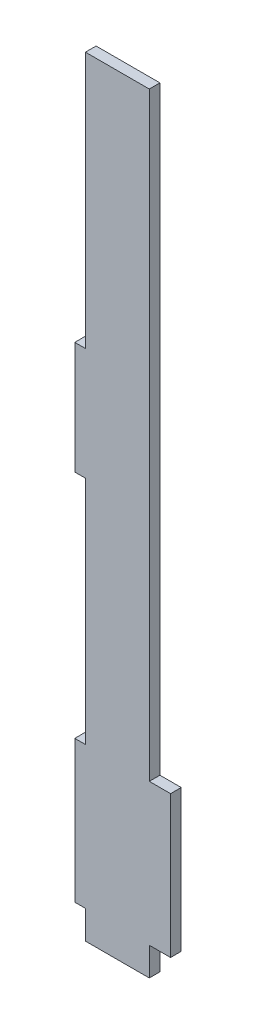
ISO-10303-21;
HEADER;
FILE_DESCRIPTION(('STEP AP214'),'2;1');
FILE_NAME('part.step','',(''),(''),'','','');
FILE_SCHEMA(('AUTOMOTIVE_DESIGN { 1 0 10303 214 1 1 1 1 }'));
ENDSEC;
DATA;
#1=APPLICATION_CONTEXT('core data for automotive mechanical design processes');
#2=APPLICATION_PROTOCOL_DEFINITION('international standard','automotive_design',2000,#1);
#3=PRODUCT_CONTEXT('',#1,'mechanical');
#4=PRODUCT('Part','Part','',(#3));
#5=PRODUCT_RELATED_PRODUCT_CATEGORY('part','',(#4));
#6=PRODUCT_DEFINITION_FORMATION('','',#4);
#7=PRODUCT_DEFINITION_CONTEXT('part definition',#1,'design');
#8=PRODUCT_DEFINITION('design','',#6,#7);
#9=PRODUCT_DEFINITION_SHAPE('','',#8);
#10=(LENGTH_UNIT() NAMED_UNIT(*) SI_UNIT(.MILLI.,.METRE.));
#11=(NAMED_UNIT(*) PLANE_ANGLE_UNIT() SI_UNIT($,.RADIAN.));
#12=(NAMED_UNIT(*) SI_UNIT($,.STERADIAN.) SOLID_ANGLE_UNIT());
#13=UNCERTAINTY_MEASURE_WITH_UNIT(LENGTH_MEASURE(1.E-05),#10,'distance_accuracy_value','');
#14=(GEOMETRIC_REPRESENTATION_CONTEXT(3) GLOBAL_UNCERTAINTY_ASSIGNED_CONTEXT((#13)) GLOBAL_UNIT_ASSIGNED_CONTEXT((#10,
#11,#12)) REPRESENTATION_CONTEXT('',''));
#15=CARTESIAN_POINT('',(0.,0.,0.));
#16=DIRECTION('',(0.,0.,1.));
#17=DIRECTION('',(1.,0.,0.));
#18=AXIS2_PLACEMENT_3D('',#15,#16,#17);
#19=CARTESIAN_POINT('',(-18.,61.,3.));
#20=DIRECTION('',(1.,0.,0.));
#21=DIRECTION('',(0.,1.,0.));
#22=AXIS2_PLACEMENT_3D('',#19,#20,#21);
#23=PLANE('',#22);
#24=DIRECTION('',(0.,-1.,0.));
#25=VECTOR('',#24,1.);
#26=CARTESIAN_POINT('',(-18.,61.,3.));
#27=LINE('',#26,#25);
#28=CARTESIAN_POINT('',(-18.,113.,3.));
#29=VERTEX_POINT('',#28);
#30=CARTESIAN_POINT('',(-18.,48.,3.));
#31=VERTEX_POINT('',#30);
#32=EDGE_CURVE('E50',#29,#31,#27,.T.);
#33=ORIENTED_EDGE('',*,*,#32,.F.);
#34=DIRECTION('',(0.,0.,1.));
#35=VECTOR('',#34,1.);
#36=CARTESIAN_POINT('',(-18.,113.,0.));
#37=LINE('',#36,#35);
#38=CARTESIAN_POINT('',(-18.,113.,0.));
#39=VERTEX_POINT('',#38);
#40=EDGE_CURVE('E179',#39,#29,#37,.T.);
#41=ORIENTED_EDGE('',*,*,#40,.F.);
#42=DIRECTION('',(0.,-1.,0.));
#43=VECTOR('',#42,1.);
#44=CARTESIAN_POINT('',(-18.,61.,0.));
#45=LINE('',#44,#43);
#46=CARTESIAN_POINT('',(-18.,48.,0.));
#47=VERTEX_POINT('',#46);
#48=EDGE_CURVE('E259',#39,#47,#45,.T.);
#49=ORIENTED_EDGE('',*,*,#48,.T.);
#50=DIRECTION('',(0.,0.,1.));
#51=VECTOR('',#50,1.);
#52=CARTESIAN_POINT('',(-18.,48.,-40.4474968323134));
#53=LINE('',#52,#51);
#54=EDGE_CURVE('E201',#47,#31,#53,.T.);
#55=ORIENTED_EDGE('',*,*,#54,.T.);
#56=EDGE_LOOP('',(#33,#41,#49,#55));
#57=FACE_BOUND('',#56,.T.);
#58=ADVANCED_FACE('F35',(#57),#23,.F.);
#59=DIRECTION('',(0.,0.,1.));
#60=VECTOR('',#59,1.);
#61=CARTESIAN_POINT('',(-18.,8.,-40.4474968323134));
#62=LINE('',#61,#60);
#63=CARTESIAN_POINT('',(-18.,8.00000000000001,0.));
#64=VERTEX_POINT('',#63);
#65=CARTESIAN_POINT('',(-18.,8.,3.));
#66=VERTEX_POINT('',#65);
#67=EDGE_CURVE('E203',#64,#66,#62,.T.);
#68=ORIENTED_EDGE('',*,*,#67,.F.);
#69=CARTESIAN_POINT('',(-18.,0.,0.));
#70=VERTEX_POINT('',#69);
#71=EDGE_CURVE('E246',#64,#70,#45,.T.);
#72=ORIENTED_EDGE('',*,*,#71,.T.);
#73=DIRECTION('',(0.,0.,-1.));
#74=VECTOR('',#73,1.);
#75=CARTESIAN_POINT('',(-18.,0.,3.));
#76=LINE('',#75,#74);
#77=CARTESIAN_POINT('',(-18.,0.,3.));
#78=VERTEX_POINT('',#77);
#79=EDGE_CURVE('E11',#78,#70,#76,.T.);
#80=ORIENTED_EDGE('',*,*,#79,.F.);
#81=EDGE_CURVE('E250',#66,#78,#27,.T.);
#82=ORIENTED_EDGE('',*,*,#81,.F.);
#83=EDGE_LOOP('',(#68,#72,#80,#82));
#84=FACE_BOUND('',#83,.T.);
#85=ADVANCED_FACE('F286',(#84),#23,.F.);
#86=CARTESIAN_POINT('',(0.,61.,3.));
#87=DIRECTION('',(-1.,0.,0.));
#88=DIRECTION('',(0.,0.,1.));
#89=AXIS2_PLACEMENT_3D('',#86,#87,#88);
#90=PLANE('',#89);
#91=DIRECTION('',(0.,0.,1.));
#92=VECTOR('',#91,1.);
#93=CARTESIAN_POINT('',(0.,48.,-40.4474968323134));
#94=LINE('',#93,#92);
#95=CARTESIAN_POINT('',(0.,48.,0.));
#96=VERTEX_POINT('',#95);
#97=CARTESIAN_POINT('',(0.,48.,3.));
#98=VERTEX_POINT('',#97);
#99=EDGE_CURVE('E240',#96,#98,#94,.T.);
#100=ORIENTED_EDGE('',*,*,#99,.F.);
#101=DIRECTION('',(0.,1.,0.));
#102=VECTOR('',#101,1.);
#103=CARTESIAN_POINT('',(0.,61.,0.));
#104=LINE('',#103,#102);
#105=CARTESIAN_POINT('',(0.,217.,0.));
#106=VERTEX_POINT('',#105);
#107=EDGE_CURVE('E261',#96,#106,#104,.T.);
#108=ORIENTED_EDGE('',*,*,#107,.T.);
#109=DIRECTION('',(0.,0.,-1.));
#110=VECTOR('',#109,1.);
#111=CARTESIAN_POINT('',(0.,217.,0.));
#112=LINE('',#111,#110);
#113=CARTESIAN_POINT('',(0.,217.,3.));
#114=VERTEX_POINT('',#113);
#115=EDGE_CURVE('E189',#114,#106,#112,.T.);
#116=ORIENTED_EDGE('',*,*,#115,.F.);
#117=DIRECTION('',(0.,1.,0.));
#118=VECTOR('',#117,1.);
#119=CARTESIAN_POINT('',(0.,61.,3.));
#120=LINE('',#119,#118);
#121=EDGE_CURVE('E252',#98,#114,#120,.T.);
#122=ORIENTED_EDGE('',*,*,#121,.F.);
#123=EDGE_LOOP('',(#100,#108,#116,#122));
#124=FACE_BOUND('',#123,.T.);
#125=ADVANCED_FACE('F314',(#124),#90,.F.);
#126=CARTESIAN_POINT('',(-18.,217.,0.));
#127=VERTEX_POINT('',#126);
#128=CARTESIAN_POINT('',(-18.,144.666148849545,0.));
#129=VERTEX_POINT('',#128);
#130=EDGE_CURVE('E256',#127,#129,#45,.T.);
#131=ORIENTED_EDGE('',*,*,#130,.T.);
#132=DIRECTION('',(0.,0.,1.));
#133=VECTOR('',#132,1.);
#134=CARTESIAN_POINT('',(-18.,144.666148849545,0.));
#135=LINE('',#134,#133);
#136=CARTESIAN_POINT('',(-18.,144.666148849545,3.));
#137=VERTEX_POINT('',#136);
#138=EDGE_CURVE('E58',#129,#137,#135,.T.);
#139=ORIENTED_EDGE('',*,*,#138,.T.);
#140=CARTESIAN_POINT('',(-18.,217.,3.));
#141=VERTEX_POINT('',#140);
#142=EDGE_CURVE('E247',#141,#137,#27,.T.);
#143=ORIENTED_EDGE('',*,*,#142,.F.);
#144=DIRECTION('',(0.,0.,1.));
#145=VECTOR('',#144,1.);
#146=CARTESIAN_POINT('',(-18.,217.,0.));
#147=LINE('',#146,#145);
#148=EDGE_CURVE('E181',#127,#141,#147,.T.);
#149=ORIENTED_EDGE('',*,*,#148,.F.);
#150=EDGE_LOOP('',(#131,#139,#143,#149));
#151=FACE_BOUND('',#150,.T.);
#152=ADVANCED_FACE('F37',(#151),#23,.F.);
#153=CARTESIAN_POINT('',(-18.,0.,3.));
#154=DIRECTION('',(0.,1.,0.));
#155=DIRECTION('',(0.,0.,1.));
#156=AXIS2_PLACEMENT_3D('',#153,#154,#155);
#157=PLANE('',#156);
#158=DIRECTION('',(1.,0.,0.));
#159=VECTOR('',#158,1.);
#160=CARTESIAN_POINT('',(-18.,0.,0.));
#161=LINE('',#160,#159);
#162=CARTESIAN_POINT('',(0.,0.,0.));
#163=VERTEX_POINT('',#162);
#164=EDGE_CURVE('E258',#70,#163,#161,.T.);
#165=ORIENTED_EDGE('',*,*,#164,.T.);
#166=DIRECTION('',(0.,0.,-1.));
#167=VECTOR('',#166,1.);
#168=CARTESIAN_POINT('',(0.,0.,3.));
#169=LINE('',#168,#167);
#170=CARTESIAN_POINT('',(0.,0.,3.));
#171=VERTEX_POINT('',#170);
#172=EDGE_CURVE('E43',#171,#163,#169,.T.);
#173=ORIENTED_EDGE('',*,*,#172,.F.);
#174=DIRECTION('',(1.,0.,0.));
#175=VECTOR('',#174,1.);
#176=CARTESIAN_POINT('',(-18.,0.,3.));
#177=LINE('',#176,#175);
#178=EDGE_CURVE('E249',#78,#171,#177,.T.);
#179=ORIENTED_EDGE('',*,*,#178,.F.);
#180=ORIENTED_EDGE('',*,*,#79,.T.);
#181=EDGE_LOOP('',(#165,#173,#179,#180));
#182=FACE_BOUND('',#181,.T.);
#183=ADVANCED_FACE('F284',(#182),#157,.F.);
#184=CARTESIAN_POINT('',(0.,8.,0.));
#185=VERTEX_POINT('',#184);
#186=EDGE_CURVE('E262',#163,#185,#104,.T.);
#187=ORIENTED_EDGE('',*,*,#186,.T.);
#188=DIRECTION('',(0.,0.,1.));
#189=VECTOR('',#188,1.);
#190=CARTESIAN_POINT('',(0.,8.,-40.4474968323134));
#191=LINE('',#190,#189);
#192=CARTESIAN_POINT('',(0.,8.00000000000001,3.));
#193=VERTEX_POINT('',#192);
#194=EDGE_CURVE('E226',#185,#193,#191,.T.);
#195=ORIENTED_EDGE('',*,*,#194,.T.);
#196=EDGE_CURVE('E253',#171,#193,#120,.T.);
#197=ORIENTED_EDGE('',*,*,#196,.F.);
#198=ORIENTED_EDGE('',*,*,#172,.T.);
#199=EDGE_LOOP('',(#187,#195,#197,#198));
#200=FACE_BOUND('',#199,.T.);
#201=ADVANCED_FACE('F269',(#200),#90,.F.);
#202=CARTESIAN_POINT('',(0.,0.,3.));
#203=DIRECTION('',(0.,0.,1.));
#204=DIRECTION('',(1.,0.,0.));
#205=AXIS2_PLACEMENT_3D('',#202,#203,#204);
#206=PLANE('',#205);
#207=ORIENTED_EDGE('',*,*,#142,.T.);
#208=DIRECTION('',(-1.,0.,0.));
#209=VECTOR('',#208,1.);
#210=CARTESIAN_POINT('',(-18.,144.666148849545,3.));
#211=LINE('',#210,#209);
#212=CARTESIAN_POINT('',(-21.,144.666148849545,3.));
#213=VERTEX_POINT('',#212);
#214=EDGE_CURVE('E176',#137,#213,#211,.T.);
#215=ORIENTED_EDGE('',*,*,#214,.T.);
#216=DIRECTION('',(0.,-1.,0.));
#217=VECTOR('',#216,1.);
#218=CARTESIAN_POINT('',(-21.,113.,3.));
#219=LINE('',#218,#217);
#220=CARTESIAN_POINT('',(-21.,113.,3.));
#221=VERTEX_POINT('',#220);
#222=EDGE_CURVE('E155',#213,#221,#219,.T.);
#223=ORIENTED_EDGE('',*,*,#222,.T.);
#224=DIRECTION('',(1.,0.,0.));
#225=VECTOR('',#224,1.);
#226=CARTESIAN_POINT('',(-18.,113.,3.));
#227=LINE('',#226,#225);
#228=EDGE_CURVE('E170',#221,#29,#227,.T.);
#229=ORIENTED_EDGE('',*,*,#228,.T.);
#230=ORIENTED_EDGE('',*,*,#32,.T.);
#231=DIRECTION('',(-1.,0.,0.));
#232=VECTOR('',#231,1.);
#233=CARTESIAN_POINT('',(-18.,48.,3.));
#234=LINE('',#233,#232);
#235=CARTESIAN_POINT('',(-21.,48.,3.));
#236=VERTEX_POINT('',#235);
#237=EDGE_CURVE('E206',#31,#236,#234,.T.);
#238=ORIENTED_EDGE('',*,*,#237,.T.);
#239=DIRECTION('',(0.,1.,0.));
#240=VECTOR('',#239,1.);
#241=CARTESIAN_POINT('',(-21.,8.,3.));
#242=LINE('',#241,#240);
#243=CARTESIAN_POINT('',(-21.,8.,3.));
#244=VERTEX_POINT('',#243);
#245=EDGE_CURVE('E209',#244,#236,#242,.T.);
#246=ORIENTED_EDGE('',*,*,#245,.F.);
#247=DIRECTION('',(-1.,0.,0.));
#248=VECTOR('',#247,1.);
#249=CARTESIAN_POINT('',(-18.,8.,3.));
#250=LINE('',#249,#248);
#251=EDGE_CURVE('E212',#66,#244,#250,.T.);
#252=ORIENTED_EDGE('',*,*,#251,.F.);
#253=ORIENTED_EDGE('',*,*,#81,.T.);
#254=ORIENTED_EDGE('',*,*,#178,.T.);
#255=ORIENTED_EDGE('',*,*,#196,.T.);
#256=DIRECTION('',(1.,0.,0.));
#257=VECTOR('',#256,1.);
#258=CARTESIAN_POINT('',(0.,8.,3.));
#259=LINE('',#258,#257);
#260=CARTESIAN_POINT('',(6.,8.,3.));
#261=VERTEX_POINT('',#260);
#262=EDGE_CURVE('E215',#193,#261,#259,.T.);
#263=ORIENTED_EDGE('',*,*,#262,.T.);
#264=DIRECTION('',(0.,1.,0.));
#265=VECTOR('',#264,1.);
#266=CARTESIAN_POINT('',(6.,0.,3.));
#267=LINE('',#266,#265);
#268=CARTESIAN_POINT('',(6.,48.,3.));
#269=VERTEX_POINT('',#268);
#270=EDGE_CURVE('E231',#261,#269,#267,.T.);
#271=ORIENTED_EDGE('',*,*,#270,.T.);
#272=DIRECTION('',(1.,0.,0.));
#273=VECTOR('',#272,1.);
#274=CARTESIAN_POINT('',(0.,48.,3.));
#275=LINE('',#274,#273);
#276=EDGE_CURVE('E234',#98,#269,#275,.T.);
#277=ORIENTED_EDGE('',*,*,#276,.F.);
#278=ORIENTED_EDGE('',*,*,#121,.T.);
#279=DIRECTION('',(1.,0.,0.));
#280=VECTOR('',#279,1.);
#281=CARTESIAN_POINT('',(-18.,217.,3.));
#282=LINE('',#281,#280);
#283=EDGE_CURVE('E186',#141,#114,#282,.T.);
#284=ORIENTED_EDGE('',*,*,#283,.F.);
#285=EDGE_LOOP('',(#207,#215,#223,#229,#230,#238,#246,#252,#253,#254,#255,#263,#271,#277,#278,#284));
#286=FACE_BOUND('',#285,.T.);
#287=ADVANCED_FACE('F281',(#286),#206,.T.);
#288=CARTESIAN_POINT('',(0.,0.,0.));
#289=DIRECTION('',(0.,0.,1.));
#290=DIRECTION('',(1.,0.,0.));
#291=AXIS2_PLACEMENT_3D('',#288,#289,#290);
#292=PLANE('',#291);
#293=ORIENTED_EDGE('',*,*,#130,.F.);
#294=DIRECTION('',(-1.,0.,0.));
#295=VECTOR('',#294,1.);
#296=CARTESIAN_POINT('',(-18.,217.,0.));
#297=LINE('',#296,#295);
#298=EDGE_CURVE('E192',#106,#127,#297,.T.);
#299=ORIENTED_EDGE('',*,*,#298,.F.);
#300=ORIENTED_EDGE('',*,*,#107,.F.);
#301=DIRECTION('',(-1.,0.,0.));
#302=VECTOR('',#301,1.);
#303=CARTESIAN_POINT('',(0.,48.,0.));
#304=LINE('',#303,#302);
#305=CARTESIAN_POINT('',(6.,48.,0.));
#306=VERTEX_POINT('',#305);
#307=EDGE_CURVE('E223',#306,#96,#304,.T.);
#308=ORIENTED_EDGE('',*,*,#307,.F.);
#309=DIRECTION('',(0.,-1.,0.));
#310=VECTOR('',#309,1.);
#311=CARTESIAN_POINT('',(6.,0.,0.));
#312=LINE('',#311,#310);
#313=CARTESIAN_POINT('',(6.,8.,0.));
#314=VERTEX_POINT('',#313);
#315=EDGE_CURVE('E228',#306,#314,#312,.T.);
#316=ORIENTED_EDGE('',*,*,#315,.T.);
#317=DIRECTION('',(-1.,0.,0.));
#318=VECTOR('',#317,1.);
#319=CARTESIAN_POINT('',(0.,8.,0.));
#320=LINE('',#319,#318);
#321=EDGE_CURVE('E225',#314,#185,#320,.T.);
#322=ORIENTED_EDGE('',*,*,#321,.T.);
#323=ORIENTED_EDGE('',*,*,#186,.F.);
#324=ORIENTED_EDGE('',*,*,#164,.F.);
#325=ORIENTED_EDGE('',*,*,#71,.F.);
#326=DIRECTION('',(1.,0.,0.));
#327=VECTOR('',#326,1.);
#328=CARTESIAN_POINT('',(-18.,8.,0.));
#329=LINE('',#328,#327);
#330=CARTESIAN_POINT('',(-21.,8.,0.));
#331=VERTEX_POINT('',#330);
#332=EDGE_CURVE('E195',#331,#64,#329,.T.);
#333=ORIENTED_EDGE('',*,*,#332,.F.);
#334=DIRECTION('',(0.,-1.,0.));
#335=VECTOR('',#334,1.);
#336=CARTESIAN_POINT('',(-21.,8.,0.));
#337=LINE('',#336,#335);
#338=CARTESIAN_POINT('',(-21.,48.,0.));
#339=VERTEX_POINT('',#338);
#340=EDGE_CURVE('E218',#339,#331,#337,.T.);
#341=ORIENTED_EDGE('',*,*,#340,.F.);
#342=DIRECTION('',(1.,0.,0.));
#343=VECTOR('',#342,1.);
#344=CARTESIAN_POINT('',(-18.,48.,0.));
#345=LINE('',#344,#343);
#346=EDGE_CURVE('E199',#339,#47,#345,.T.);
#347=ORIENTED_EDGE('',*,*,#346,.T.);
#348=ORIENTED_EDGE('',*,*,#48,.F.);
#349=DIRECTION('',(1.,0.,0.));
#350=VECTOR('',#349,1.);
#351=CARTESIAN_POINT('',(-18.,113.,0.));
#352=LINE('',#351,#350);
#353=CARTESIAN_POINT('',(-21.,113.,0.));
#354=VERTEX_POINT('',#353);
#355=EDGE_CURVE('E167',#354,#39,#352,.T.);
#356=ORIENTED_EDGE('',*,*,#355,.F.);
#357=DIRECTION('',(0.,-1.,0.));
#358=VECTOR('',#357,1.);
#359=CARTESIAN_POINT('',(-21.,113.,0.));
#360=LINE('',#359,#358);
#361=CARTESIAN_POINT('',(-21.,144.666148849545,0.));
#362=VERTEX_POINT('',#361);
#363=EDGE_CURVE('E152',#362,#354,#360,.T.);
#364=ORIENTED_EDGE('',*,*,#363,.F.);
#365=DIRECTION('',(-1.,0.,0.));
#366=VECTOR('',#365,1.);
#367=CARTESIAN_POINT('',(-18.,144.666148849545,0.));
#368=LINE('',#367,#366);
#369=EDGE_CURVE('E165',#129,#362,#368,.T.);
#370=ORIENTED_EDGE('',*,*,#369,.F.);
#371=EDGE_LOOP('',(#293,#299,#300,#308,#316,#322,#323,#324,#325,#333,#341,#347,#348,#356,#364,#370));
#372=FACE_BOUND('',#371,.T.);
#373=ADVANCED_FACE('F164',(#372),#292,.F.);
#374=CARTESIAN_POINT('',(0.,8.,-40.4474968323134));
#375=DIRECTION('',(0.,-1.,0.));
#376=DIRECTION('',(0.,0.,-1.));
#377=AXIS2_PLACEMENT_3D('',#374,#375,#376);
#378=PLANE('',#377);
#379=ORIENTED_EDGE('',*,*,#321,.F.);
#380=DIRECTION('',(0.,0.,1.));
#381=VECTOR('',#380,1.);
#382=CARTESIAN_POINT('',(6.,8.,-40.4474968323134));
#383=LINE('',#382,#381);
#384=EDGE_CURVE('E237',#314,#261,#383,.T.);
#385=ORIENTED_EDGE('',*,*,#384,.T.);
#386=ORIENTED_EDGE('',*,*,#262,.F.);
#387=ORIENTED_EDGE('',*,*,#194,.F.);
#388=EDGE_LOOP('',(#379,#385,#386,#387));
#389=FACE_BOUND('',#388,.T.);
#390=ADVANCED_FACE('F279',(#389),#378,.T.);
#391=CARTESIAN_POINT('',(0.,48.,-40.4474968323134));
#392=DIRECTION('',(0.,-1.,0.));
#393=DIRECTION('',(0.,0.,-1.));
#394=AXIS2_PLACEMENT_3D('',#391,#392,#393);
#395=PLANE('',#394);
#396=DIRECTION('',(0.,0.,1.));
#397=VECTOR('',#396,1.);
#398=CARTESIAN_POINT('',(6.,48.,-40.4474968323134));
#399=LINE('',#398,#397);
#400=EDGE_CURVE('E242',#306,#269,#399,.T.);
#401=ORIENTED_EDGE('',*,*,#400,.F.);
#402=ORIENTED_EDGE('',*,*,#307,.T.);
#403=ORIENTED_EDGE('',*,*,#99,.T.);
#404=ORIENTED_EDGE('',*,*,#276,.T.);
#405=EDGE_LOOP('',(#401,#402,#403,#404));
#406=FACE_BOUND('',#405,.T.);
#407=ADVANCED_FACE('F331',(#406),#395,.F.);
#408=CARTESIAN_POINT('',(6.,0.,-40.4474968323134));
#409=DIRECTION('',(1.,0.,0.));
#410=DIRECTION('',(0.,0.,-1.));
#411=AXIS2_PLACEMENT_3D('',#408,#409,#410);
#412=PLANE('',#411);
#413=ORIENTED_EDGE('',*,*,#315,.F.);
#414=ORIENTED_EDGE('',*,*,#400,.T.);
#415=ORIENTED_EDGE('',*,*,#270,.F.);
#416=ORIENTED_EDGE('',*,*,#384,.F.);
#417=EDGE_LOOP('',(#413,#414,#415,#416));
#418=FACE_BOUND('',#417,.T.);
#419=ADVANCED_FACE('F335',(#418),#412,.T.);
#420=CARTESIAN_POINT('',(-18.,8.,-40.4474968323134));
#421=DIRECTION('',(0.,1.,0.));
#422=DIRECTION('',(0.,0.,1.));
#423=AXIS2_PLACEMENT_3D('',#420,#421,#422);
#424=PLANE('',#423);
#425=DIRECTION('',(0.,0.,1.));
#426=VECTOR('',#425,1.);
#427=CARTESIAN_POINT('',(-21.,8.,-40.4474968323134));
#428=LINE('',#427,#426);
#429=EDGE_CURVE('E196',#331,#244,#428,.T.);
#430=ORIENTED_EDGE('',*,*,#429,.F.);
#431=ORIENTED_EDGE('',*,*,#332,.T.);
#432=ORIENTED_EDGE('',*,*,#67,.T.);
#433=ORIENTED_EDGE('',*,*,#251,.T.);
#434=EDGE_LOOP('',(#430,#431,#432,#433));
#435=FACE_BOUND('',#434,.T.);
#436=ADVANCED_FACE('F337',(#435),#424,.F.);
#437=CARTESIAN_POINT('',(-21.,8.,-40.4474968323134));
#438=DIRECTION('',(1.,0.,0.));
#439=DIRECTION('',(0.,0.,-1.));
#440=AXIS2_PLACEMENT_3D('',#437,#438,#439);
#441=PLANE('',#440);
#442=DIRECTION('',(0.,0.,1.));
#443=VECTOR('',#442,1.);
#444=CARTESIAN_POINT('',(-21.,48.,-40.4474968323134));
#445=LINE('',#444,#443);
#446=EDGE_CURVE('E198',#339,#236,#445,.T.);
#447=ORIENTED_EDGE('',*,*,#446,.F.);
#448=ORIENTED_EDGE('',*,*,#340,.T.);
#449=ORIENTED_EDGE('',*,*,#429,.T.);
#450=ORIENTED_EDGE('',*,*,#245,.T.);
#451=EDGE_LOOP('',(#447,#448,#449,#450));
#452=FACE_BOUND('',#451,.T.);
#453=ADVANCED_FACE('F343',(#452),#441,.F.);
#454=CARTESIAN_POINT('',(-18.,48.,-40.4474968323134));
#455=DIRECTION('',(0.,1.,0.));
#456=DIRECTION('',(0.,0.,1.));
#457=AXIS2_PLACEMENT_3D('',#454,#455,#456);
#458=PLANE('',#457);
#459=ORIENTED_EDGE('',*,*,#346,.F.);
#460=ORIENTED_EDGE('',*,*,#446,.T.);
#461=ORIENTED_EDGE('',*,*,#237,.F.);
#462=ORIENTED_EDGE('',*,*,#54,.F.);
#463=EDGE_LOOP('',(#459,#460,#461,#462));
#464=FACE_BOUND('',#463,.T.);
#465=ADVANCED_FACE('F292',(#464),#458,.T.);
#466=CARTESIAN_POINT('',(0.,217.,0.));
#467=DIRECTION('',(0.,1.,0.));
#468=DIRECTION('',(0.,0.,1.));
#469=AXIS2_PLACEMENT_3D('',#466,#467,#468);
#470=PLANE('',#469);
#471=ORIENTED_EDGE('',*,*,#148,.T.);
#472=ORIENTED_EDGE('',*,*,#283,.T.);
#473=ORIENTED_EDGE('',*,*,#115,.T.);
#474=ORIENTED_EDGE('',*,*,#298,.T.);
#475=EDGE_LOOP('',(#471,#472,#473,#474));
#476=FACE_BOUND('',#475,.T.);
#477=ADVANCED_FACE('F298',(#476),#470,.T.);
#478=CARTESIAN_POINT('',(-18.,113.,0.));
#479=DIRECTION('',(0.,-1.,0.));
#480=DIRECTION('',(0.,0.,-1.));
#481=AXIS2_PLACEMENT_3D('',#478,#479,#480);
#482=PLANE('',#481);
#483=ORIENTED_EDGE('',*,*,#228,.F.);
#484=DIRECTION('',(0.,0.,1.));
#485=VECTOR('',#484,1.);
#486=CARTESIAN_POINT('',(-21.,113.,0.));
#487=LINE('',#486,#485);
#488=EDGE_CURVE('E160',#354,#221,#487,.T.);
#489=ORIENTED_EDGE('',*,*,#488,.F.);
#490=ORIENTED_EDGE('',*,*,#355,.T.);
#491=ORIENTED_EDGE('',*,*,#40,.T.);
#492=EDGE_LOOP('',(#483,#489,#490,#491));
#493=FACE_BOUND('',#492,.T.);
#494=ADVANCED_FACE('F296',(#493),#482,.T.);
#495=CARTESIAN_POINT('',(-21.,113.,0.));
#496=DIRECTION('',(-1.,0.,0.));
#497=DIRECTION('',(0.,0.,1.));
#498=AXIS2_PLACEMENT_3D('',#495,#496,#497);
#499=PLANE('',#498);
#500=ORIENTED_EDGE('',*,*,#222,.F.);
#501=DIRECTION('',(0.,0.,1.));
#502=VECTOR('',#501,1.);
#503=CARTESIAN_POINT('',(-21.,144.666148849545,0.));
#504=LINE('',#503,#502);
#505=EDGE_CURVE('E149',#362,#213,#504,.T.);
#506=ORIENTED_EDGE('',*,*,#505,.F.);
#507=ORIENTED_EDGE('',*,*,#363,.T.);
#508=ORIENTED_EDGE('',*,*,#488,.T.);
#509=EDGE_LOOP('',(#500,#506,#507,#508));
#510=FACE_BOUND('',#509,.T.);
#511=ADVANCED_FACE('F151',(#510),#499,.T.);
#512=CARTESIAN_POINT('',(-18.,144.666148849545,0.));
#513=DIRECTION('',(0.,1.,0.));
#514=DIRECTION('',(0.,0.,1.));
#515=AXIS2_PLACEMENT_3D('',#512,#513,#514);
#516=PLANE('',#515);
#517=ORIENTED_EDGE('',*,*,#214,.F.);
#518=ORIENTED_EDGE('',*,*,#138,.F.);
#519=ORIENTED_EDGE('',*,*,#369,.T.);
#520=ORIENTED_EDGE('',*,*,#505,.T.);
#521=EDGE_LOOP('',(#517,#518,#519,#520));
#522=FACE_BOUND('',#521,.T.);
#523=ADVANCED_FACE('F169',(#522),#516,.T.);
#524=CLOSED_SHELL('',(#58,#85,#125,#152,#183,#201,#287,#373,#390,#407,#419,#436,#453,#465,#477,
#494,#511,#523));
#525=MANIFOLD_SOLID_BREP('B2',#524);
#526=ADVANCED_BREP_SHAPE_REPRESENTATION('',(#18,#525),#14);
#527=SHAPE_DEFINITION_REPRESENTATION(#9,#526);
ENDSEC;
END-ISO-10303-21;
